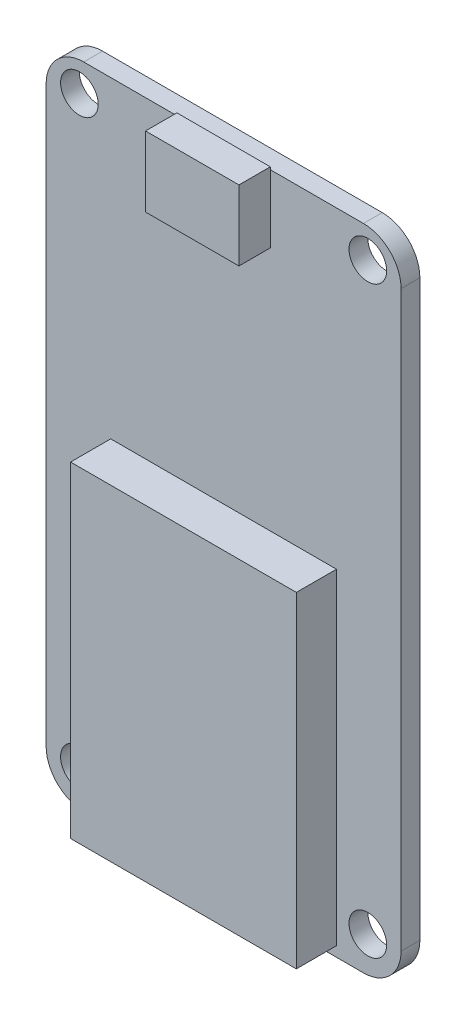
ISO-10303-21;
HEADER;
FILE_DESCRIPTION(('STEP AP214'),'2;1');
FILE_NAME('part.step','',(''),(''),'','','');
FILE_SCHEMA(('AUTOMOTIVE_DESIGN { 1 0 10303 214 1 1 1 1 }'));
ENDSEC;
DATA;
#1=APPLICATION_CONTEXT('core data for automotive mechanical design processes');
#2=APPLICATION_PROTOCOL_DEFINITION('international standard','automotive_design',2000,#1);
#3=PRODUCT_CONTEXT('',#1,'mechanical');
#4=PRODUCT('Part','Part','',(#3));
#5=PRODUCT_RELATED_PRODUCT_CATEGORY('part','',(#4));
#6=PRODUCT_DEFINITION_FORMATION('','',#4);
#7=PRODUCT_DEFINITION_CONTEXT('part definition',#1,'design');
#8=PRODUCT_DEFINITION('design','',#6,#7);
#9=PRODUCT_DEFINITION_SHAPE('','',#8);
#10=(LENGTH_UNIT() NAMED_UNIT(*) SI_UNIT(.MILLI.,.METRE.));
#11=(NAMED_UNIT(*) PLANE_ANGLE_UNIT() SI_UNIT($,.RADIAN.));
#12=(NAMED_UNIT(*) SI_UNIT($,.STERADIAN.) SOLID_ANGLE_UNIT());
#13=UNCERTAINTY_MEASURE_WITH_UNIT(LENGTH_MEASURE(1.E-05),#10,'distance_accuracy_value','');
#14=(GEOMETRIC_REPRESENTATION_CONTEXT(3) GLOBAL_UNCERTAINTY_ASSIGNED_CONTEXT((#13)) GLOBAL_UNIT_ASSIGNED_CONTEXT((#10,
#11,#12)) REPRESENTATION_CONTEXT('',''));
#15=CARTESIAN_POINT('',(0.,0.,0.));
#16=DIRECTION('',(0.,0.,1.));
#17=DIRECTION('',(1.,0.,0.));
#18=AXIS2_PLACEMENT_3D('',#15,#16,#17);
#19=CARTESIAN_POINT('',(0.,0.,1.5));
#20=DIRECTION('',(0.,0.,-1.));
#21=DIRECTION('',(-1.,0.,0.));
#22=AXIS2_PLACEMENT_3D('',#19,#20,#21);
#23=PLANE('',#22);
#24=DIRECTION('',(0.,-1.,0.));
#25=VECTOR('',#24,1.);
#26=CARTESIAN_POINT('',(5.15,26.8,1.5));
#27=LINE('',#26,#25);
#28=CARTESIAN_POINT('',(5.15,26.8,1.5));
#29=VERTEX_POINT('',#28);
#30=CARTESIAN_POINT('',(5.15,0.799999999999999,1.5));
#31=VERTEX_POINT('',#30);
#32=EDGE_CURVE('E177',#29,#31,#27,.T.);
#33=ORIENTED_EDGE('',*,*,#32,.F.);
#34=DIRECTION('',(-1.,0.,0.));
#35=VECTOR('',#34,1.);
#36=CARTESIAN_POINT('',(5.15,26.8,1.5));
#37=LINE('',#36,#35);
#38=CARTESIAN_POINT('',(23.15,26.8,1.5));
#39=VERTEX_POINT('',#38);
#40=EDGE_CURVE('E190',#39,#29,#37,.T.);
#41=ORIENTED_EDGE('',*,*,#40,.F.);
#42=DIRECTION('',(0.,1.,0.));
#43=VECTOR('',#42,1.);
#44=CARTESIAN_POINT('',(23.15,26.8,1.5));
#45=LINE('',#44,#43);
#46=CARTESIAN_POINT('',(23.15,0.8,1.5));
#47=VERTEX_POINT('',#46);
#48=EDGE_CURVE('E199',#47,#39,#45,.T.);
#49=ORIENTED_EDGE('',*,*,#48,.F.);
#50=DIRECTION('',(1.,0.,0.));
#51=VECTOR('',#50,1.);
#52=CARTESIAN_POINT('',(5.15,0.799999999999999,1.5));
#53=LINE('',#52,#51);
#54=EDGE_CURVE('E180',#31,#47,#53,.T.);
#55=ORIENTED_EDGE('',*,*,#54,.F.);
#56=EDGE_LOOP('',(#33,#41,#49,#55));
#57=FACE_BOUND('',#56,.T.);
#58=CARTESIAN_POINT('',(2.65,49.4,1.5));
#59=DIRECTION('',(0.,0.,1.));
#60=DIRECTION('',(1.,0.,0.));
#61=AXIS2_PLACEMENT_3D('',#58,#59,#60);
#62=CIRCLE('',#61,1.5);
#63=CARTESIAN_POINT('',(4.15,49.4,1.5));
#64=VERTEX_POINT('',#63);
#65=EDGE_CURVE('E234',#64,#64,#62,.T.);
#66=ORIENTED_EDGE('',*,*,#65,.F.);
#67=EDGE_LOOP('',(#66));
#68=FACE_BOUND('',#67,.T.);
#69=CARTESIAN_POINT('',(25.65,49.4,1.5));
#70=DIRECTION('',(0.,0.,1.));
#71=DIRECTION('',(1.,0.,0.));
#72=AXIS2_PLACEMENT_3D('',#69,#70,#71);
#73=CIRCLE('',#72,1.5);
#74=CARTESIAN_POINT('',(27.15,49.4,1.5));
#75=VERTEX_POINT('',#74);
#76=EDGE_CURVE('E228',#75,#75,#73,.T.);
#77=ORIENTED_EDGE('',*,*,#76,.F.);
#78=EDGE_LOOP('',(#77));
#79=FACE_BOUND('',#78,.T.);
#80=CARTESIAN_POINT('',(25.65,2.85,1.5));
#81=DIRECTION('',(0.,0.,1.));
#82=DIRECTION('',(1.,0.,0.));
#83=AXIS2_PLACEMENT_3D('',#80,#81,#82);
#84=CIRCLE('',#83,1.5);
#85=CARTESIAN_POINT('',(27.15,2.85,1.5));
#86=VERTEX_POINT('',#85);
#87=EDGE_CURVE('E222',#86,#86,#84,.T.);
#88=ORIENTED_EDGE('',*,*,#87,.F.);
#89=EDGE_LOOP('',(#88));
#90=FACE_BOUND('',#89,.T.);
#91=CARTESIAN_POINT('',(2.65,2.85,1.5));
#92=DIRECTION('',(0.,0.,1.));
#93=DIRECTION('',(1.,0.,0.));
#94=AXIS2_PLACEMENT_3D('',#91,#92,#93);
#95=CIRCLE('',#94,1.5);
#96=CARTESIAN_POINT('',(4.15,2.85,1.5));
#97=VERTEX_POINT('',#96);
#98=EDGE_CURVE('E216',#97,#97,#95,.T.);
#99=ORIENTED_EDGE('',*,*,#98,.F.);
#100=EDGE_LOOP('',(#99));
#101=FACE_BOUND('',#100,.T.);
#102=DIRECTION('',(0.,1.,0.));
#103=VECTOR('',#102,1.);
#104=CARTESIAN_POINT('',(17.875,46.35,1.5));
#105=LINE('',#104,#103);
#106=CARTESIAN_POINT('',(17.875,46.35,1.5));
#107=VERTEX_POINT('',#106);
#108=CARTESIAN_POINT('',(17.875,51.75,1.5));
#109=VERTEX_POINT('',#108);
#110=EDGE_CURVE('E49',#107,#109,#105,.T.);
#111=ORIENTED_EDGE('',*,*,#110,.F.);
#112=DIRECTION('',(1.,0.,0.));
#113=VECTOR('',#112,1.);
#114=CARTESIAN_POINT('',(17.875,46.35,1.5));
#115=LINE('',#114,#113);
#116=CARTESIAN_POINT('',(10.425,46.35,1.5));
#117=VERTEX_POINT('',#116);
#118=EDGE_CURVE('E53',#117,#107,#115,.T.);
#119=ORIENTED_EDGE('',*,*,#118,.F.);
#120=DIRECTION('',(0.,-1.,0.));
#121=VECTOR('',#120,1.);
#122=CARTESIAN_POINT('',(10.425,46.35,1.5));
#123=LINE('',#122,#121);
#124=CARTESIAN_POINT('',(10.425,51.75,1.5));
#125=VERTEX_POINT('',#124);
#126=EDGE_CURVE('E339',#125,#117,#123,.T.);
#127=ORIENTED_EDGE('',*,*,#126,.F.);
#128=DIRECTION('',(-1.,0.,0.));
#129=VECTOR('',#128,1.);
#130=CARTESIAN_POINT('',(0.,51.75,1.5));
#131=LINE('',#130,#129);
#132=CARTESIAN_POINT('',(3.,51.75,1.5));
#133=VERTEX_POINT('',#132);
#134=EDGE_CURVE('E250',#125,#133,#131,.T.);
#135=ORIENTED_EDGE('',*,*,#134,.T.);
#136=CARTESIAN_POINT('',(3.,48.75,1.5));
#137=DIRECTION('',(0.,0.,-1.));
#138=DIRECTION('',(-1.,0.,0.));
#139=AXIS2_PLACEMENT_3D('',#136,#137,#138);
#140=CIRCLE('',#139,3.);
#141=CARTESIAN_POINT('',(0.,48.75,1.5));
#142=VERTEX_POINT('',#141);
#143=EDGE_CURVE('E282',#133,#142,#140,.F.);
#144=ORIENTED_EDGE('',*,*,#143,.T.);
#145=DIRECTION('',(0.,-1.,0.));
#146=VECTOR('',#145,1.);
#147=CARTESIAN_POINT('',(0.,0.,1.5));
#148=LINE('',#147,#146);
#149=CARTESIAN_POINT('',(0.,3.,1.5));
#150=VERTEX_POINT('',#149);
#151=EDGE_CURVE('E240',#142,#150,#148,.T.);
#152=ORIENTED_EDGE('',*,*,#151,.T.);
#153=CARTESIAN_POINT('',(3.,3.,1.5));
#154=DIRECTION('',(0.,0.,-1.));
#155=DIRECTION('',(-1.,0.,0.));
#156=AXIS2_PLACEMENT_3D('',#153,#154,#155);
#157=CIRCLE('',#156,3.);
#158=CARTESIAN_POINT('',(3.,0.,1.5));
#159=VERTEX_POINT('',#158);
#160=EDGE_CURVE('E288',#150,#159,#157,.F.);
#161=ORIENTED_EDGE('',*,*,#160,.T.);
#162=DIRECTION('',(1.,0.,0.));
#163=VECTOR('',#162,1.);
#164=CARTESIAN_POINT('',(0.,0.,1.5));
#165=LINE('',#164,#163);
#166=CARTESIAN_POINT('',(25.3,0.,1.5));
#167=VERTEX_POINT('',#166);
#168=EDGE_CURVE('E243',#159,#167,#165,.T.);
#169=ORIENTED_EDGE('',*,*,#168,.T.);
#170=CARTESIAN_POINT('',(25.3,3.,1.5));
#171=DIRECTION('',(0.,0.,-1.));
#172=DIRECTION('',(-1.,0.,0.));
#173=AXIS2_PLACEMENT_3D('',#170,#171,#172);
#174=CIRCLE('',#173,3.);
#175=CARTESIAN_POINT('',(28.3,3.,1.5));
#176=VERTEX_POINT('',#175);
#177=EDGE_CURVE('E286',#167,#176,#174,.F.);
#178=ORIENTED_EDGE('',*,*,#177,.T.);
#179=DIRECTION('',(0.,1.,0.));
#180=VECTOR('',#179,1.);
#181=CARTESIAN_POINT('',(28.3,0.,1.5));
#182=LINE('',#181,#180);
#183=CARTESIAN_POINT('',(28.3,48.75,1.5));
#184=VERTEX_POINT('',#183);
#185=EDGE_CURVE('E247',#176,#184,#182,.T.);
#186=ORIENTED_EDGE('',*,*,#185,.T.);
#187=CARTESIAN_POINT('',(25.3,48.75,1.5));
#188=DIRECTION('',(0.,0.,-1.));
#189=DIRECTION('',(-1.,0.,0.));
#190=AXIS2_PLACEMENT_3D('',#187,#188,#189);
#191=CIRCLE('',#190,3.);
#192=CARTESIAN_POINT('',(25.3,51.75,1.5));
#193=VERTEX_POINT('',#192);
#194=EDGE_CURVE('E284',#184,#193,#191,.F.);
#195=ORIENTED_EDGE('',*,*,#194,.T.);
#196=EDGE_CURVE('E251',#193,#109,#131,.T.);
#197=ORIENTED_EDGE('',*,*,#196,.T.);
#198=EDGE_LOOP('',(#111,#119,#127,#135,#144,#152,#161,#169,#178,#186,#195,#197));
#199=FACE_BOUND('',#198,.T.);
#200=ADVANCED_FACE('F34',(#57,#68,#79,#90,#101,#199),#23,.F.);
#201=CARTESIAN_POINT('',(0.,0.,0.));
#202=DIRECTION('',(0.,0.,-1.));
#203=DIRECTION('',(-1.,0.,0.));
#204=AXIS2_PLACEMENT_3D('',#201,#202,#203);
#205=PLANE('',#204);
#206=CARTESIAN_POINT('',(25.65,2.85,0.));
#207=DIRECTION('',(0.,0.,1.));
#208=DIRECTION('',(1.,0.,0.));
#209=AXIS2_PLACEMENT_3D('',#206,#207,#208);
#210=CIRCLE('',#209,1.5);
#211=CARTESIAN_POINT('',(27.15,2.85,0.));
#212=VERTEX_POINT('',#211);
#213=EDGE_CURVE('E219',#212,#212,#210,.T.);
#214=ORIENTED_EDGE('',*,*,#213,.T.);
#215=EDGE_LOOP('',(#214));
#216=FACE_BOUND('',#215,.T.);
#217=CARTESIAN_POINT('',(2.65,49.4,0.));
#218=DIRECTION('',(0.,0.,1.));
#219=DIRECTION('',(1.,0.,0.));
#220=AXIS2_PLACEMENT_3D('',#217,#218,#219);
#221=CIRCLE('',#220,1.5);
#222=CARTESIAN_POINT('',(4.15,49.4,0.));
#223=VERTEX_POINT('',#222);
#224=EDGE_CURVE('E231',#223,#223,#221,.T.);
#225=ORIENTED_EDGE('',*,*,#224,.T.);
#226=EDGE_LOOP('',(#225));
#227=FACE_BOUND('',#226,.T.);
#228=DIRECTION('',(1.,0.,0.));
#229=VECTOR('',#228,1.);
#230=CARTESIAN_POINT('',(0.,0.,0.));
#231=LINE('',#230,#229);
#232=CARTESIAN_POINT('',(3.,0.,0.));
#233=VERTEX_POINT('',#232);
#234=CARTESIAN_POINT('',(25.3,0.,0.));
#235=VERTEX_POINT('',#234);
#236=EDGE_CURVE('E257',#233,#235,#231,.T.);
#237=ORIENTED_EDGE('',*,*,#236,.F.);
#238=CARTESIAN_POINT('',(3.,3.,0.));
#239=DIRECTION('',(0.,0.,-1.));
#240=DIRECTION('',(-1.,0.,0.));
#241=AXIS2_PLACEMENT_3D('',#238,#239,#240);
#242=CIRCLE('',#241,3.);
#243=CARTESIAN_POINT('',(0.,3.,0.));
#244=VERTEX_POINT('',#243);
#245=EDGE_CURVE('E275',#233,#244,#242,.T.);
#246=ORIENTED_EDGE('',*,*,#245,.T.);
#247=DIRECTION('',(0.,-1.,0.));
#248=VECTOR('',#247,1.);
#249=CARTESIAN_POINT('',(0.,0.,0.));
#250=LINE('',#249,#248);
#251=CARTESIAN_POINT('',(0.,48.75,0.));
#252=VERTEX_POINT('',#251);
#253=EDGE_CURVE('E237',#252,#244,#250,.T.);
#254=ORIENTED_EDGE('',*,*,#253,.F.);
#255=CARTESIAN_POINT('',(3.,48.75,0.));
#256=DIRECTION('',(0.,0.,-1.));
#257=DIRECTION('',(-1.,0.,0.));
#258=AXIS2_PLACEMENT_3D('',#255,#256,#257);
#259=CIRCLE('',#258,3.);
#260=CARTESIAN_POINT('',(3.,51.75,0.));
#261=VERTEX_POINT('',#260);
#262=EDGE_CURVE('E269',#252,#261,#259,.T.);
#263=ORIENTED_EDGE('',*,*,#262,.T.);
#264=DIRECTION('',(-1.,0.,0.));
#265=VECTOR('',#264,1.);
#266=CARTESIAN_POINT('',(0.,51.75,0.));
#267=LINE('',#266,#265);
#268=CARTESIAN_POINT('',(25.3,51.75,0.));
#269=VERTEX_POINT('',#268);
#270=EDGE_CURVE('E244',#269,#261,#267,.T.);
#271=ORIENTED_EDGE('',*,*,#270,.F.);
#272=CARTESIAN_POINT('',(25.3,48.75,0.));
#273=DIRECTION('',(0.,0.,-1.));
#274=DIRECTION('',(-1.,0.,0.));
#275=AXIS2_PLACEMENT_3D('',#272,#273,#274);
#276=CIRCLE('',#275,3.);
#277=CARTESIAN_POINT('',(28.3,48.75,0.));
#278=VERTEX_POINT('',#277);
#279=EDGE_CURVE('E271',#269,#278,#276,.T.);
#280=ORIENTED_EDGE('',*,*,#279,.T.);
#281=DIRECTION('',(0.,1.,0.));
#282=VECTOR('',#281,1.);
#283=CARTESIAN_POINT('',(28.3,0.,0.));
#284=LINE('',#283,#282);
#285=CARTESIAN_POINT('',(28.3,3.,0.));
#286=VERTEX_POINT('',#285);
#287=EDGE_CURVE('E260',#286,#278,#284,.T.);
#288=ORIENTED_EDGE('',*,*,#287,.F.);
#289=CARTESIAN_POINT('',(25.3,3.,0.));
#290=DIRECTION('',(0.,0.,-1.));
#291=DIRECTION('',(-1.,0.,0.));
#292=AXIS2_PLACEMENT_3D('',#289,#290,#291);
#293=CIRCLE('',#292,3.);
#294=EDGE_CURVE('E273',#286,#235,#293,.T.);
#295=ORIENTED_EDGE('',*,*,#294,.T.);
#296=EDGE_LOOP('',(#237,#246,#254,#263,#271,#280,#288,#295));
#297=FACE_BOUND('',#296,.T.);
#298=CARTESIAN_POINT('',(25.65,49.4,0.));
#299=DIRECTION('',(0.,0.,1.));
#300=DIRECTION('',(1.,0.,0.));
#301=AXIS2_PLACEMENT_3D('',#298,#299,#300);
#302=CIRCLE('',#301,1.5);
#303=CARTESIAN_POINT('',(27.15,49.4,0.));
#304=VERTEX_POINT('',#303);
#305=EDGE_CURVE('E225',#304,#304,#302,.T.);
#306=ORIENTED_EDGE('',*,*,#305,.T.);
#307=EDGE_LOOP('',(#306));
#308=FACE_BOUND('',#307,.T.);
#309=CARTESIAN_POINT('',(2.65,2.85,0.));
#310=DIRECTION('',(0.,0.,1.));
#311=DIRECTION('',(1.,0.,0.));
#312=AXIS2_PLACEMENT_3D('',#309,#310,#311);
#313=CIRCLE('',#312,1.5);
#314=CARTESIAN_POINT('',(4.15,2.85,0.));
#315=VERTEX_POINT('',#314);
#316=EDGE_CURVE('E215',#315,#315,#313,.T.);
#317=ORIENTED_EDGE('',*,*,#316,.T.);
#318=EDGE_LOOP('',(#317));
#319=FACE_BOUND('',#318,.T.);
#320=ADVANCED_FACE('F362',(#216,#227,#297,#308,#319),#205,.T.);
#321=CARTESIAN_POINT('',(0.,0.,1.5));
#322=DIRECTION('',(1.,0.,0.));
#323=DIRECTION('',(0.,0.,-1.));
#324=AXIS2_PLACEMENT_3D('',#321,#322,#323);
#325=PLANE('',#324);
#326=ORIENTED_EDGE('',*,*,#253,.T.);
#327=DIRECTION('',(0.,0.,-1.));
#328=VECTOR('',#327,1.);
#329=CARTESIAN_POINT('',(0.,3.,1.5));
#330=LINE('',#329,#328);
#331=EDGE_CURVE('E280',#244,#150,#330,.F.);
#332=ORIENTED_EDGE('',*,*,#331,.T.);
#333=ORIENTED_EDGE('',*,*,#151,.F.);
#334=DIRECTION('',(0.,0.,-1.));
#335=VECTOR('',#334,1.);
#336=CARTESIAN_POINT('',(0.,48.75,1.5));
#337=LINE('',#336,#335);
#338=EDGE_CURVE('E277',#142,#252,#337,.T.);
#339=ORIENTED_EDGE('',*,*,#338,.T.);
#340=EDGE_LOOP('',(#326,#332,#333,#339));
#341=FACE_BOUND('',#340,.T.);
#342=ADVANCED_FACE('F306',(#341),#325,.F.);
#343=CARTESIAN_POINT('',(0.,0.,1.5));
#344=DIRECTION('',(0.,1.,0.));
#345=DIRECTION('',(0.,0.,1.));
#346=AXIS2_PLACEMENT_3D('',#343,#344,#345);
#347=PLANE('',#346);
#348=ORIENTED_EDGE('',*,*,#168,.F.);
#349=DIRECTION('',(0.,0.,-1.));
#350=VECTOR('',#349,1.);
#351=CARTESIAN_POINT('',(3.,0.,1.5));
#352=LINE('',#351,#350);
#353=EDGE_CURVE('E266',#159,#233,#352,.T.);
#354=ORIENTED_EDGE('',*,*,#353,.T.);
#355=ORIENTED_EDGE('',*,*,#236,.T.);
#356=DIRECTION('',(0.,0.,-1.));
#357=VECTOR('',#356,1.);
#358=CARTESIAN_POINT('',(25.3,0.,1.5));
#359=LINE('',#358,#357);
#360=EDGE_CURVE('E253',#235,#167,#359,.F.);
#361=ORIENTED_EDGE('',*,*,#360,.T.);
#362=EDGE_LOOP('',(#348,#354,#355,#361));
#363=FACE_BOUND('',#362,.T.);
#364=ADVANCED_FACE('F315',(#363),#347,.F.);
#365=CARTESIAN_POINT('',(28.3,0.,1.5));
#366=DIRECTION('',(-1.,0.,0.));
#367=DIRECTION('',(0.,-1.,0.));
#368=AXIS2_PLACEMENT_3D('',#365,#366,#367);
#369=PLANE('',#368);
#370=ORIENTED_EDGE('',*,*,#185,.F.);
#371=DIRECTION('',(0.,0.,-1.));
#372=VECTOR('',#371,1.);
#373=CARTESIAN_POINT('',(28.3,3.,1.5));
#374=LINE('',#373,#372);
#375=EDGE_CURVE('E292',#176,#286,#374,.T.);
#376=ORIENTED_EDGE('',*,*,#375,.T.);
#377=ORIENTED_EDGE('',*,*,#287,.T.);
#378=DIRECTION('',(0.,0.,-1.));
#379=VECTOR('',#378,1.);
#380=CARTESIAN_POINT('',(28.3,48.75,1.5));
#381=LINE('',#380,#379);
#382=EDGE_CURVE('E290',#278,#184,#381,.F.);
#383=ORIENTED_EDGE('',*,*,#382,.T.);
#384=EDGE_LOOP('',(#370,#376,#377,#383));
#385=FACE_BOUND('',#384,.T.);
#386=ADVANCED_FACE('F324',(#385),#369,.F.);
#387=CARTESIAN_POINT('',(0.,51.75,1.5));
#388=DIRECTION('',(0.,-1.,0.));
#389=DIRECTION('',(0.,0.,-1.));
#390=AXIS2_PLACEMENT_3D('',#387,#388,#389);
#391=PLANE('',#390);
#392=ORIENTED_EDGE('',*,*,#196,.F.);
#393=DIRECTION('',(0.,0.,-1.));
#394=VECTOR('',#393,1.);
#395=CARTESIAN_POINT('',(25.3,51.75,1.5));
#396=LINE('',#395,#394);
#397=EDGE_CURVE('E11',#193,#269,#396,.T.);
#398=ORIENTED_EDGE('',*,*,#397,.T.);
#399=ORIENTED_EDGE('',*,*,#270,.T.);
#400=DIRECTION('',(0.,0.,-1.));
#401=VECTOR('',#400,1.);
#402=CARTESIAN_POINT('',(3.,51.75,1.5));
#403=LINE('',#402,#401);
#404=EDGE_CURVE('E42',#261,#133,#403,.F.);
#405=ORIENTED_EDGE('',*,*,#404,.T.);
#406=ORIENTED_EDGE('',*,*,#134,.F.);
#407=EDGE_CURVE('E254',#109,#125,#131,.T.);
#408=ORIENTED_EDGE('',*,*,#407,.F.);
#409=EDGE_LOOP('',(#392,#398,#399,#405,#406,#408));
#410=FACE_BOUND('',#409,.T.);
#411=ADVANCED_FACE('F299',(#410),#391,.F.);
#412=CARTESIAN_POINT('',(2.65,49.4,1.5));
#413=DIRECTION('',(0.,0.,-1.));
#414=DIRECTION('',(-1.,0.,0.));
#415=AXIS2_PLACEMENT_3D('',#412,#413,#414);
#416=CYLINDRICAL_SURFACE('',#415,1.5);
#417=ORIENTED_EDGE('',*,*,#65,.T.);
#418=EDGE_LOOP('',(#417));
#419=FACE_BOUND('',#418,.T.);
#420=ORIENTED_EDGE('',*,*,#224,.F.);
#421=EDGE_LOOP('',(#420));
#422=FACE_BOUND('',#421,.T.);
#423=ADVANCED_FACE('F372',(#419,#422),#416,.F.);
#424=CARTESIAN_POINT('',(25.65,49.4,1.5));
#425=DIRECTION('',(0.,0.,-1.));
#426=DIRECTION('',(-1.,0.,0.));
#427=AXIS2_PLACEMENT_3D('',#424,#425,#426);
#428=CYLINDRICAL_SURFACE('',#427,1.5);
#429=ORIENTED_EDGE('',*,*,#76,.T.);
#430=EDGE_LOOP('',(#429));
#431=FACE_BOUND('',#430,.T.);
#432=ORIENTED_EDGE('',*,*,#305,.F.);
#433=EDGE_LOOP('',(#432));
#434=FACE_BOUND('',#433,.T.);
#435=ADVANCED_FACE('F411',(#431,#434),#428,.F.);
#436=CARTESIAN_POINT('',(25.65,2.85,1.5));
#437=DIRECTION('',(0.,0.,-1.));
#438=DIRECTION('',(-1.,0.,0.));
#439=AXIS2_PLACEMENT_3D('',#436,#437,#438);
#440=CYLINDRICAL_SURFACE('',#439,1.5);
#441=ORIENTED_EDGE('',*,*,#87,.T.);
#442=EDGE_LOOP('',(#441));
#443=FACE_BOUND('',#442,.T.);
#444=ORIENTED_EDGE('',*,*,#213,.F.);
#445=EDGE_LOOP('',(#444));
#446=FACE_BOUND('',#445,.T.);
#447=ADVANCED_FACE('F408',(#443,#446),#440,.F.);
#448=CARTESIAN_POINT('',(2.65,2.85,1.5));
#449=DIRECTION('',(0.,0.,-1.));
#450=DIRECTION('',(-1.,0.,0.));
#451=AXIS2_PLACEMENT_3D('',#448,#449,#450);
#452=CYLINDRICAL_SURFACE('',#451,1.5);
#453=ORIENTED_EDGE('',*,*,#98,.T.);
#454=EDGE_LOOP('',(#453));
#455=FACE_BOUND('',#454,.T.);
#456=ORIENTED_EDGE('',*,*,#316,.F.);
#457=EDGE_LOOP('',(#456));
#458=FACE_BOUND('',#457,.T.);
#459=ADVANCED_FACE('F385',(#455,#458),#452,.F.);
#460=CARTESIAN_POINT('',(3.,3.,1.5));
#461=DIRECTION('',(0.,0.,-1.));
#462=DIRECTION('',(-1.,0.,0.));
#463=AXIS2_PLACEMENT_3D('',#460,#461,#462);
#464=CYLINDRICAL_SURFACE('',#463,3.);
#465=ORIENTED_EDGE('',*,*,#160,.F.);
#466=ORIENTED_EDGE('',*,*,#331,.F.);
#467=ORIENTED_EDGE('',*,*,#245,.F.);
#468=ORIENTED_EDGE('',*,*,#353,.F.);
#469=EDGE_LOOP('',(#465,#466,#467,#468));
#470=FACE_BOUND('',#469,.T.);
#471=ADVANCED_FACE('F310',(#470),#464,.T.);
#472=CARTESIAN_POINT('',(25.3,3.,1.5));
#473=DIRECTION('',(0.,0.,-1.));
#474=DIRECTION('',(-1.,0.,0.));
#475=AXIS2_PLACEMENT_3D('',#472,#473,#474);
#476=CYLINDRICAL_SURFACE('',#475,3.);
#477=ORIENTED_EDGE('',*,*,#177,.F.);
#478=ORIENTED_EDGE('',*,*,#360,.F.);
#479=ORIENTED_EDGE('',*,*,#294,.F.);
#480=ORIENTED_EDGE('',*,*,#375,.F.);
#481=EDGE_LOOP('',(#477,#478,#479,#480));
#482=FACE_BOUND('',#481,.T.);
#483=ADVANCED_FACE('F319',(#482),#476,.T.);
#484=CARTESIAN_POINT('',(25.3,48.75,1.5));
#485=DIRECTION('',(0.,0.,-1.));
#486=DIRECTION('',(-1.,0.,0.));
#487=AXIS2_PLACEMENT_3D('',#484,#485,#486);
#488=CYLINDRICAL_SURFACE('',#487,3.);
#489=ORIENTED_EDGE('',*,*,#194,.F.);
#490=ORIENTED_EDGE('',*,*,#382,.F.);
#491=ORIENTED_EDGE('',*,*,#279,.F.);
#492=ORIENTED_EDGE('',*,*,#397,.F.);
#493=EDGE_LOOP('',(#489,#490,#491,#492));
#494=FACE_BOUND('',#493,.T.);
#495=ADVANCED_FACE('F328',(#494),#488,.T.);
#496=CARTESIAN_POINT('',(3.,48.75,1.5));
#497=DIRECTION('',(0.,0.,-1.));
#498=DIRECTION('',(-1.,0.,0.));
#499=AXIS2_PLACEMENT_3D('',#496,#497,#498);
#500=CYLINDRICAL_SURFACE('',#499,3.);
#501=ORIENTED_EDGE('',*,*,#143,.F.);
#502=ORIENTED_EDGE('',*,*,#404,.F.);
#503=ORIENTED_EDGE('',*,*,#262,.F.);
#504=ORIENTED_EDGE('',*,*,#338,.F.);
#505=EDGE_LOOP('',(#501,#502,#503,#504));
#506=FACE_BOUND('',#505,.T.);
#507=ADVANCED_FACE('F36',(#506),#500,.T.);
#508=CARTESIAN_POINT('',(5.15,26.8,4.7));
#509=DIRECTION('',(1.,0.,0.));
#510=DIRECTION('',(0.,0.,-1.));
#511=AXIS2_PLACEMENT_3D('',#508,#509,#510);
#512=PLANE('',#511);
#513=ORIENTED_EDGE('',*,*,#32,.T.);
#514=DIRECTION('',(0.,0.,-1.));
#515=VECTOR('',#514,1.);
#516=CARTESIAN_POINT('',(5.15,0.799999999999999,4.7));
#517=LINE('',#516,#515);
#518=CARTESIAN_POINT('',(5.15,0.799999999999999,4.7));
#519=VERTEX_POINT('',#518);
#520=EDGE_CURVE('E212',#519,#31,#517,.T.);
#521=ORIENTED_EDGE('',*,*,#520,.F.);
#522=DIRECTION('',(0.,-1.,0.));
#523=VECTOR('',#522,1.);
#524=CARTESIAN_POINT('',(5.15,26.8,4.7));
#525=LINE('',#524,#523);
#526=CARTESIAN_POINT('',(5.15,26.8,4.7));
#527=VERTEX_POINT('',#526);
#528=EDGE_CURVE('E186',#527,#519,#525,.T.);
#529=ORIENTED_EDGE('',*,*,#528,.F.);
#530=DIRECTION('',(0.,0.,-1.));
#531=VECTOR('',#530,1.);
#532=CARTESIAN_POINT('',(5.15,26.8,4.7));
#533=LINE('',#532,#531);
#534=EDGE_CURVE('E195',#527,#29,#533,.T.);
#535=ORIENTED_EDGE('',*,*,#534,.T.);
#536=EDGE_LOOP('',(#513,#521,#529,#535));
#537=FACE_BOUND('',#536,.T.);
#538=ADVANCED_FACE('F391',(#537),#512,.F.);
#539=CARTESIAN_POINT('',(5.15,0.799999999999999,4.7));
#540=DIRECTION('',(0.,1.,0.));
#541=DIRECTION('',(-1.,0.,0.));
#542=AXIS2_PLACEMENT_3D('',#539,#540,#541);
#543=PLANE('',#542);
#544=ORIENTED_EDGE('',*,*,#54,.T.);
#545=DIRECTION('',(0.,0.,-1.));
#546=VECTOR('',#545,1.);
#547=CARTESIAN_POINT('',(23.15,0.8,4.7));
#548=LINE('',#547,#546);
#549=CARTESIAN_POINT('',(23.15,0.8,4.7));
#550=VERTEX_POINT('',#549);
#551=EDGE_CURVE('E209',#550,#47,#548,.T.);
#552=ORIENTED_EDGE('',*,*,#551,.F.);
#553=DIRECTION('',(1.,0.,0.));
#554=VECTOR('',#553,1.);
#555=CARTESIAN_POINT('',(5.15,0.799999999999999,4.7));
#556=LINE('',#555,#554);
#557=EDGE_CURVE('E189',#519,#550,#556,.T.);
#558=ORIENTED_EDGE('',*,*,#557,.F.);
#559=ORIENTED_EDGE('',*,*,#520,.T.);
#560=EDGE_LOOP('',(#544,#552,#558,#559));
#561=FACE_BOUND('',#560,.T.);
#562=ADVANCED_FACE('F395',(#561),#543,.F.);
#563=CARTESIAN_POINT('',(23.15,26.8,4.7));
#564=DIRECTION('',(-1.,0.,0.));
#565=DIRECTION('',(0.,0.,1.));
#566=AXIS2_PLACEMENT_3D('',#563,#564,#565);
#567=PLANE('',#566);
#568=ORIENTED_EDGE('',*,*,#48,.T.);
#569=DIRECTION('',(0.,0.,-1.));
#570=VECTOR('',#569,1.);
#571=CARTESIAN_POINT('',(23.15,26.8,4.7));
#572=LINE('',#571,#570);
#573=CARTESIAN_POINT('',(23.15,26.8,4.7));
#574=VERTEX_POINT('',#573);
#575=EDGE_CURVE('E206',#574,#39,#572,.T.);
#576=ORIENTED_EDGE('',*,*,#575,.F.);
#577=DIRECTION('',(0.,1.,0.));
#578=VECTOR('',#577,1.);
#579=CARTESIAN_POINT('',(23.15,26.8,4.7));
#580=LINE('',#579,#578);
#581=EDGE_CURVE('E192',#550,#574,#580,.T.);
#582=ORIENTED_EDGE('',*,*,#581,.F.);
#583=ORIENTED_EDGE('',*,*,#551,.T.);
#584=EDGE_LOOP('',(#568,#576,#582,#583));
#585=FACE_BOUND('',#584,.T.);
#586=ADVANCED_FACE('F401',(#585),#567,.F.);
#587=CARTESIAN_POINT('',(5.15,26.8,4.7));
#588=DIRECTION('',(0.,-1.,0.));
#589=DIRECTION('',(0.,0.,-1.));
#590=AXIS2_PLACEMENT_3D('',#587,#588,#589);
#591=PLANE('',#590);
#592=ORIENTED_EDGE('',*,*,#40,.T.);
#593=ORIENTED_EDGE('',*,*,#534,.F.);
#594=DIRECTION('',(-1.,0.,0.));
#595=VECTOR('',#594,1.);
#596=CARTESIAN_POINT('',(5.15,26.8,4.7));
#597=LINE('',#596,#595);
#598=EDGE_CURVE('E194',#574,#527,#597,.T.);
#599=ORIENTED_EDGE('',*,*,#598,.F.);
#600=ORIENTED_EDGE('',*,*,#575,.T.);
#601=EDGE_LOOP('',(#592,#593,#599,#600));
#602=FACE_BOUND('',#601,.T.);
#603=ADVANCED_FACE('F524',(#602),#591,.F.);
#604=CARTESIAN_POINT('',(0.,0.,4.7));
#605=DIRECTION('',(0.,0.,1.));
#606=DIRECTION('',(1.,0.,0.));
#607=AXIS2_PLACEMENT_3D('',#604,#605,#606);
#608=PLANE('',#607);
#609=ORIENTED_EDGE('',*,*,#528,.T.);
#610=ORIENTED_EDGE('',*,*,#557,.T.);
#611=ORIENTED_EDGE('',*,*,#581,.T.);
#612=ORIENTED_EDGE('',*,*,#598,.T.);
#613=EDGE_LOOP('',(#609,#610,#611,#612));
#614=FACE_BOUND('',#613,.T.);
#615=ADVANCED_FACE('F533',(#614),#608,.T.);
#616=CARTESIAN_POINT('',(0.,0.,1.5));
#617=DIRECTION('',(0.,0.,1.));
#618=DIRECTION('',(1.,0.,0.));
#619=AXIS2_PLACEMENT_3D('',#616,#617,#618);
#620=PLANE('',#619);
#621=CARTESIAN_POINT('',(17.875,51.95,1.5));
#622=VERTEX_POINT('',#621);
#623=EDGE_CURVE('E175',#109,#622,#105,.T.);
#624=ORIENTED_EDGE('',*,*,#623,.F.);
#625=ORIENTED_EDGE('',*,*,#407,.T.);
#626=CARTESIAN_POINT('',(10.425,51.95,1.5));
#627=VERTEX_POINT('',#626);
#628=EDGE_CURVE('E335',#627,#125,#123,.T.);
#629=ORIENTED_EDGE('',*,*,#628,.F.);
#630=DIRECTION('',(-1.,0.,0.));
#631=VECTOR('',#630,1.);
#632=CARTESIAN_POINT('',(17.875,51.95,1.5));
#633=LINE('',#632,#631);
#634=EDGE_CURVE('E343',#622,#627,#633,.T.);
#635=ORIENTED_EDGE('',*,*,#634,.F.);
#636=EDGE_LOOP('',(#624,#625,#629,#635));
#637=FACE_BOUND('',#636,.T.);
#638=ADVANCED_FACE('F334',(#637),#620,.F.);
#639=CARTESIAN_POINT('',(17.875,46.35,4.));
#640=DIRECTION('',(-1.,0.,0.));
#641=DIRECTION('',(0.,0.,1.));
#642=AXIS2_PLACEMENT_3D('',#639,#640,#641);
#643=PLANE('',#642);
#644=ORIENTED_EDGE('',*,*,#110,.T.);
#645=ORIENTED_EDGE('',*,*,#623,.T.);
#646=DIRECTION('',(0.,0.,-1.));
#647=VECTOR('',#646,1.);
#648=CARTESIAN_POINT('',(17.875,51.95,4.));
#649=LINE('',#648,#647);
#650=CARTESIAN_POINT('',(17.875,51.95,4.));
#651=VERTEX_POINT('',#650);
#652=EDGE_CURVE('E157',#651,#622,#649,.T.);
#653=ORIENTED_EDGE('',*,*,#652,.F.);
#654=DIRECTION('',(0.,1.,0.));
#655=VECTOR('',#654,1.);
#656=CARTESIAN_POINT('',(17.875,46.35,4.));
#657=LINE('',#656,#655);
#658=CARTESIAN_POINT('',(17.875,46.35,4.));
#659=VERTEX_POINT('',#658);
#660=EDGE_CURVE('E163',#659,#651,#657,.T.);
#661=ORIENTED_EDGE('',*,*,#660,.F.);
#662=DIRECTION('',(0.,0.,-1.));
#663=VECTOR('',#662,1.);
#664=CARTESIAN_POINT('',(17.875,46.35,4.));
#665=LINE('',#664,#663);
#666=EDGE_CURVE('E347',#659,#107,#665,.T.);
#667=ORIENTED_EDGE('',*,*,#666,.T.);
#668=EDGE_LOOP('',(#644,#645,#653,#661,#667));
#669=FACE_BOUND('',#668,.T.);
#670=ADVANCED_FACE('F173',(#669),#643,.F.);
#671=CARTESIAN_POINT('',(17.875,51.95,4.));
#672=DIRECTION('',(0.,-1.,0.));
#673=DIRECTION('',(0.,0.,-1.));
#674=AXIS2_PLACEMENT_3D('',#671,#672,#673);
#675=PLANE('',#674);
#676=ORIENTED_EDGE('',*,*,#634,.T.);
#677=DIRECTION('',(0.,0.,-1.));
#678=VECTOR('',#677,1.);
#679=CARTESIAN_POINT('',(10.425,51.95,4.));
#680=LINE('',#679,#678);
#681=CARTESIAN_POINT('',(10.425,51.95,4.));
#682=VERTEX_POINT('',#681);
#683=EDGE_CURVE('E159',#682,#627,#680,.T.);
#684=ORIENTED_EDGE('',*,*,#683,.F.);
#685=DIRECTION('',(-1.,0.,0.));
#686=VECTOR('',#685,1.);
#687=CARTESIAN_POINT('',(17.875,51.95,4.));
#688=LINE('',#687,#686);
#689=EDGE_CURVE('E153',#651,#682,#688,.T.);
#690=ORIENTED_EDGE('',*,*,#689,.F.);
#691=ORIENTED_EDGE('',*,*,#652,.T.);
#692=EDGE_LOOP('',(#676,#684,#690,#691));
#693=FACE_BOUND('',#692,.T.);
#694=ADVANCED_FACE('F155',(#693),#675,.F.);
#695=CARTESIAN_POINT('',(10.425,46.35,4.));
#696=DIRECTION('',(1.,0.,0.));
#697=DIRECTION('',(0.,0.,-1.));
#698=AXIS2_PLACEMENT_3D('',#695,#696,#697);
#699=PLANE('',#698);
#700=ORIENTED_EDGE('',*,*,#628,.T.);
#701=ORIENTED_EDGE('',*,*,#126,.T.);
#702=DIRECTION('',(0.,0.,-1.));
#703=VECTOR('',#702,1.);
#704=CARTESIAN_POINT('',(10.425,46.35,4.));
#705=LINE('',#704,#703);
#706=CARTESIAN_POINT('',(10.425,46.35,4.));
#707=VERTEX_POINT('',#706);
#708=EDGE_CURVE('E182',#707,#117,#705,.T.);
#709=ORIENTED_EDGE('',*,*,#708,.F.);
#710=DIRECTION('',(0.,-1.,0.));
#711=VECTOR('',#710,1.);
#712=CARTESIAN_POINT('',(10.425,46.35,4.));
#713=LINE('',#712,#711);
#714=EDGE_CURVE('E162',#682,#707,#713,.T.);
#715=ORIENTED_EDGE('',*,*,#714,.F.);
#716=ORIENTED_EDGE('',*,*,#683,.T.);
#717=EDGE_LOOP('',(#700,#701,#709,#715,#716));
#718=FACE_BOUND('',#717,.T.);
#719=ADVANCED_FACE('F337',(#718),#699,.F.);
#720=CARTESIAN_POINT('',(17.875,46.35,4.));
#721=DIRECTION('',(0.,1.,0.));
#722=DIRECTION('',(0.,0.,1.));
#723=AXIS2_PLACEMENT_3D('',#720,#721,#722);
#724=PLANE('',#723);
#725=ORIENTED_EDGE('',*,*,#118,.T.);
#726=ORIENTED_EDGE('',*,*,#666,.F.);
#727=DIRECTION('',(1.,0.,0.));
#728=VECTOR('',#727,1.);
#729=CARTESIAN_POINT('',(17.875,46.35,4.));
#730=LINE('',#729,#728);
#731=EDGE_CURVE('E168',#707,#659,#730,.T.);
#732=ORIENTED_EDGE('',*,*,#731,.F.);
#733=ORIENTED_EDGE('',*,*,#708,.T.);
#734=EDGE_LOOP('',(#725,#726,#732,#733));
#735=FACE_BOUND('',#734,.T.);
#736=ADVANCED_FACE('F349',(#735),#724,.F.);
#737=CARTESIAN_POINT('',(0.,0.,4.));
#738=DIRECTION('',(0.,0.,1.));
#739=DIRECTION('',(1.,0.,0.));
#740=AXIS2_PLACEMENT_3D('',#737,#738,#739);
#741=PLANE('',#740);
#742=ORIENTED_EDGE('',*,*,#660,.T.);
#743=ORIENTED_EDGE('',*,*,#689,.T.);
#744=ORIENTED_EDGE('',*,*,#714,.T.);
#745=ORIENTED_EDGE('',*,*,#731,.T.);
#746=EDGE_LOOP('',(#742,#743,#744,#745));
#747=FACE_BOUND('',#746,.T.);
#748=ADVANCED_FACE('F166',(#747),#741,.T.);
#749=CLOSED_SHELL('',(#200,#320,#342,#364,#386,#411,#423,#435,#447,#459,#471,#483,#495,#507,
#538,#562,#586,#603,#615,#638,#670,#694,#719,#736,#748));
#750=MANIFOLD_SOLID_BREP('B2',#749);
#751=ADVANCED_BREP_SHAPE_REPRESENTATION('',(#18,#750),#14);
#752=SHAPE_DEFINITION_REPRESENTATION(#9,#751);
ENDSEC;
END-ISO-10303-21;
